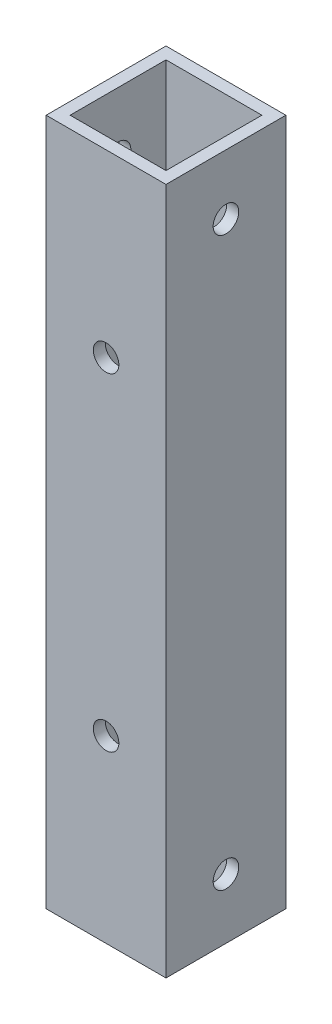
ISO-10303-21;
HEADER;
FILE_DESCRIPTION(('STEP AP214'),'2;1');
FILE_NAME('part.step','',(''),(''),'','','');
FILE_SCHEMA(('AUTOMOTIVE_DESIGN { 1 0 10303 214 1 1 1 1 }'));
ENDSEC;
DATA;
#1=APPLICATION_CONTEXT('core data for automotive mechanical design processes');
#2=APPLICATION_PROTOCOL_DEFINITION('international standard','automotive_design',2000,#1);
#3=PRODUCT_CONTEXT('',#1,'mechanical');
#4=PRODUCT('Part','Part','',(#3));
#5=PRODUCT_RELATED_PRODUCT_CATEGORY('part','',(#4));
#6=PRODUCT_DEFINITION_FORMATION('','',#4);
#7=PRODUCT_DEFINITION_CONTEXT('part definition',#1,'design');
#8=PRODUCT_DEFINITION('design','',#6,#7);
#9=PRODUCT_DEFINITION_SHAPE('','',#8);
#10=(LENGTH_UNIT() NAMED_UNIT(*) SI_UNIT(.MILLI.,.METRE.));
#11=(NAMED_UNIT(*) PLANE_ANGLE_UNIT() SI_UNIT($,.RADIAN.));
#12=(NAMED_UNIT(*) SI_UNIT($,.STERADIAN.) SOLID_ANGLE_UNIT());
#13=UNCERTAINTY_MEASURE_WITH_UNIT(LENGTH_MEASURE(1.E-05),#10,'distance_accuracy_value','');
#14=(GEOMETRIC_REPRESENTATION_CONTEXT(3) GLOBAL_UNCERTAINTY_ASSIGNED_CONTEXT((#13)) GLOBAL_UNIT_ASSIGNED_CONTEXT((#10,
#11,#12)) REPRESENTATION_CONTEXT('',''));
#15=CARTESIAN_POINT('',(0.,0.,0.));
#16=DIRECTION('',(0.,0.,1.));
#17=DIRECTION('',(1.,0.,0.));
#18=AXIS2_PLACEMENT_3D('',#15,#16,#17);
#19=CARTESIAN_POINT('',(0.,86.,0.));
#20=DIRECTION('',(0.,1.,0.));
#21=DIRECTION('',(0.,0.,1.));
#22=AXIS2_PLACEMENT_3D('',#19,#20,#21);
#23=PLANE('',#22);
#24=DIRECTION('',(0.,0.,-1.));
#25=VECTOR('',#24,1.);
#26=CARTESIAN_POINT('',(7.5,86.,-7.5));
#27=LINE('',#26,#25);
#28=CARTESIAN_POINT('',(7.5,86.,7.5));
#29=VERTEX_POINT('',#28);
#30=CARTESIAN_POINT('',(7.5,86.,-7.5));
#31=VERTEX_POINT('',#30);
#32=EDGE_CURVE('E157',#29,#31,#27,.T.);
#33=ORIENTED_EDGE('',*,*,#32,.T.);
#34=DIRECTION('',(-1.,0.,0.));
#35=VECTOR('',#34,1.);
#36=CARTESIAN_POINT('',(-7.5,86.,-7.5));
#37=LINE('',#36,#35);
#38=CARTESIAN_POINT('',(-7.5,86.,-7.5));
#39=VERTEX_POINT('',#38);
#40=EDGE_CURVE('E161',#31,#39,#37,.T.);
#41=ORIENTED_EDGE('',*,*,#40,.T.);
#42=DIRECTION('',(0.,0.,1.));
#43=VECTOR('',#42,1.);
#44=CARTESIAN_POINT('',(-7.5,86.,-7.5));
#45=LINE('',#44,#43);
#46=CARTESIAN_POINT('',(-7.5,86.,7.5));
#47=VERTEX_POINT('',#46);
#48=EDGE_CURVE('E165',#39,#47,#45,.T.);
#49=ORIENTED_EDGE('',*,*,#48,.T.);
#50=DIRECTION('',(1.,0.,0.));
#51=VECTOR('',#50,1.);
#52=CARTESIAN_POINT('',(-7.5,86.,7.5));
#53=LINE('',#52,#51);
#54=EDGE_CURVE('E168',#47,#29,#53,.T.);
#55=ORIENTED_EDGE('',*,*,#54,.T.);
#56=EDGE_LOOP('',(#33,#41,#49,#55));
#57=FACE_BOUND('',#56,.T.);
#58=DIRECTION('',(1.,0.,0.));
#59=VECTOR('',#58,1.);
#60=CARTESIAN_POINT('',(-6.,86.,6.));
#61=LINE('',#60,#59);
#62=CARTESIAN_POINT('',(-6.,86.,6.));
#63=VERTEX_POINT('',#62);
#64=CARTESIAN_POINT('',(6.,86.,6.));
#65=VERTEX_POINT('',#64);
#66=EDGE_CURVE('E116',#63,#65,#61,.T.);
#67=ORIENTED_EDGE('',*,*,#66,.F.);
#68=DIRECTION('',(0.,0.,1.));
#69=VECTOR('',#68,1.);
#70=CARTESIAN_POINT('',(-6.,86.,-6.));
#71=LINE('',#70,#69);
#72=CARTESIAN_POINT('',(-6.,86.,-6.));
#73=VERTEX_POINT('',#72);
#74=EDGE_CURVE('E107',#73,#63,#71,.T.);
#75=ORIENTED_EDGE('',*,*,#74,.F.);
#76=DIRECTION('',(-1.,0.,0.));
#77=VECTOR('',#76,1.);
#78=CARTESIAN_POINT('',(-6.,86.,-6.));
#79=LINE('',#78,#77);
#80=CARTESIAN_POINT('',(6.,86.,-6.));
#81=VERTEX_POINT('',#80);
#82=EDGE_CURVE('E133',#81,#73,#79,.T.);
#83=ORIENTED_EDGE('',*,*,#82,.F.);
#84=DIRECTION('',(0.,0.,-1.));
#85=VECTOR('',#84,1.);
#86=CARTESIAN_POINT('',(6.,86.,-6.));
#87=LINE('',#86,#85);
#88=EDGE_CURVE('E129',#65,#81,#87,.T.);
#89=ORIENTED_EDGE('',*,*,#88,.F.);
#90=EDGE_LOOP('',(#67,#75,#83,#89));
#91=FACE_BOUND('',#90,.T.);
#92=ADVANCED_FACE('F39',(#57,#91),#23,.T.);
#93=CARTESIAN_POINT('',(0.,0.,0.));
#94=DIRECTION('',(0.,1.,0.));
#95=DIRECTION('',(0.,0.,1.));
#96=AXIS2_PLACEMENT_3D('',#93,#94,#95);
#97=PLANE('',#96);
#98=DIRECTION('',(0.,0.,-1.));
#99=VECTOR('',#98,1.);
#100=CARTESIAN_POINT('',(7.5,0.,-7.5));
#101=LINE('',#100,#99);
#102=CARTESIAN_POINT('',(7.5,0.,7.5));
#103=VERTEX_POINT('',#102);
#104=CARTESIAN_POINT('',(7.5,0.,-7.5));
#105=VERTEX_POINT('',#104);
#106=EDGE_CURVE('E125',#103,#105,#101,.T.);
#107=ORIENTED_EDGE('',*,*,#106,.F.);
#108=DIRECTION('',(1.,0.,0.));
#109=VECTOR('',#108,1.);
#110=CARTESIAN_POINT('',(-7.5,0.,7.5));
#111=LINE('',#110,#109);
#112=CARTESIAN_POINT('',(-7.5,0.,7.5));
#113=VERTEX_POINT('',#112);
#114=EDGE_CURVE('E162',#113,#103,#111,.T.);
#115=ORIENTED_EDGE('',*,*,#114,.F.);
#116=DIRECTION('',(0.,0.,1.));
#117=VECTOR('',#116,1.);
#118=CARTESIAN_POINT('',(-7.5,0.,-7.5));
#119=LINE('',#118,#117);
#120=CARTESIAN_POINT('',(-7.5,0.,-7.5));
#121=VERTEX_POINT('',#120);
#122=EDGE_CURVE('E178',#121,#113,#119,.T.);
#123=ORIENTED_EDGE('',*,*,#122,.F.);
#124=DIRECTION('',(-1.,0.,0.));
#125=VECTOR('',#124,1.);
#126=CARTESIAN_POINT('',(-7.5,0.,-7.5));
#127=LINE('',#126,#125);
#128=EDGE_CURVE('E175',#105,#121,#127,.T.);
#129=ORIENTED_EDGE('',*,*,#128,.F.);
#130=EDGE_LOOP('',(#107,#115,#123,#129));
#131=FACE_BOUND('',#130,.T.);
#132=DIRECTION('',(0.,0.,1.));
#133=VECTOR('',#132,1.);
#134=CARTESIAN_POINT('',(-6.,0.,-6.));
#135=LINE('',#134,#133);
#136=CARTESIAN_POINT('',(-6.,0.,-6.));
#137=VERTEX_POINT('',#136);
#138=CARTESIAN_POINT('',(-6.,0.,6.));
#139=VERTEX_POINT('',#138);
#140=EDGE_CURVE('E65',#137,#139,#135,.T.);
#141=ORIENTED_EDGE('',*,*,#140,.T.);
#142=DIRECTION('',(1.,0.,0.));
#143=VECTOR('',#142,1.);
#144=CARTESIAN_POINT('',(-6.,0.,6.));
#145=LINE('',#144,#143);
#146=CARTESIAN_POINT('',(6.,0.,6.));
#147=VERTEX_POINT('',#146);
#148=EDGE_CURVE('E123',#139,#147,#145,.T.);
#149=ORIENTED_EDGE('',*,*,#148,.T.);
#150=DIRECTION('',(0.,0.,-1.));
#151=VECTOR('',#150,1.);
#152=CARTESIAN_POINT('',(6.,0.,-6.));
#153=LINE('',#152,#151);
#154=CARTESIAN_POINT('',(6.,0.,-6.));
#155=VERTEX_POINT('',#154);
#156=EDGE_CURVE('E144',#147,#155,#153,.T.);
#157=ORIENTED_EDGE('',*,*,#156,.T.);
#158=DIRECTION('',(-1.,0.,0.));
#159=VECTOR('',#158,1.);
#160=CARTESIAN_POINT('',(-6.,0.,-6.));
#161=LINE('',#160,#159);
#162=EDGE_CURVE('E117',#155,#137,#161,.T.);
#163=ORIENTED_EDGE('',*,*,#162,.T.);
#164=EDGE_LOOP('',(#141,#149,#157,#163));
#165=FACE_BOUND('',#164,.T.);
#166=ADVANCED_FACE('F288',(#131,#165),#97,.F.);
#167=CARTESIAN_POINT('',(7.5,86.,-7.5));
#168=DIRECTION('',(-1.,0.,0.));
#169=DIRECTION('',(0.,0.,1.));
#170=AXIS2_PLACEMENT_3D('',#167,#168,#169);
#171=PLANE('',#170);
#172=CARTESIAN_POINT('',(7.5,78.5,0.));
#173=DIRECTION('',(1.,0.,0.));
#174=DIRECTION('',(0.,0.,-1.));
#175=AXIS2_PLACEMENT_3D('',#172,#173,#174);
#176=CIRCLE('',#175,1.6);
#177=CARTESIAN_POINT('',(7.5,78.5,-1.6));
#178=VERTEX_POINT('',#177);
#179=EDGE_CURVE('E214',#178,#178,#176,.T.);
#180=ORIENTED_EDGE('',*,*,#179,.F.);
#181=EDGE_LOOP('',(#180));
#182=FACE_BOUND('',#181,.T.);
#183=CARTESIAN_POINT('',(7.5,7.5,0.));
#184=DIRECTION('',(1.,0.,0.));
#185=DIRECTION('',(0.,0.,-1.));
#186=AXIS2_PLACEMENT_3D('',#183,#184,#185);
#187=CIRCLE('',#186,1.6);
#188=CARTESIAN_POINT('',(7.5,7.5,-1.6));
#189=VERTEX_POINT('',#188);
#190=EDGE_CURVE('E226',#189,#189,#187,.T.);
#191=ORIENTED_EDGE('',*,*,#190,.F.);
#192=EDGE_LOOP('',(#191));
#193=FACE_BOUND('',#192,.T.);
#194=ORIENTED_EDGE('',*,*,#106,.T.);
#195=DIRECTION('',(0.,-1.,0.));
#196=VECTOR('',#195,1.);
#197=CARTESIAN_POINT('',(7.5,86.,-7.5));
#198=LINE('',#197,#196);
#199=EDGE_CURVE('E11',#31,#105,#198,.T.);
#200=ORIENTED_EDGE('',*,*,#199,.F.);
#201=ORIENTED_EDGE('',*,*,#32,.F.);
#202=DIRECTION('',(0.,-1.,0.));
#203=VECTOR('',#202,1.);
#204=CARTESIAN_POINT('',(7.5,86.,7.5));
#205=LINE('',#204,#203);
#206=EDGE_CURVE('E171',#29,#103,#205,.T.);
#207=ORIENTED_EDGE('',*,*,#206,.T.);
#208=EDGE_LOOP('',(#194,#200,#201,#207));
#209=FACE_BOUND('',#208,.T.);
#210=ADVANCED_FACE('F41',(#182,#193,#209),#171,.F.);
#211=CARTESIAN_POINT('',(-7.5,86.,-7.5));
#212=DIRECTION('',(0.,0.,1.));
#213=DIRECTION('',(1.,0.,0.));
#214=AXIS2_PLACEMENT_3D('',#211,#212,#213);
#215=PLANE('',#214);
#216=CARTESIAN_POINT('',(0.,63.5,-7.5));
#217=DIRECTION('',(0.,0.,1.));
#218=DIRECTION('',(1.,0.,0.));
#219=AXIS2_PLACEMENT_3D('',#216,#217,#218);
#220=CIRCLE('',#219,1.6);
#221=CARTESIAN_POINT('',(1.6,63.5,-7.5));
#222=VERTEX_POINT('',#221);
#223=EDGE_CURVE('E198',#222,#222,#220,.T.);
#224=ORIENTED_EDGE('',*,*,#223,.T.);
#225=EDGE_LOOP('',(#224));
#226=FACE_BOUND('',#225,.T.);
#227=CARTESIAN_POINT('',(0.,22.5,-7.5));
#228=DIRECTION('',(0.,0.,1.));
#229=DIRECTION('',(1.,0.,0.));
#230=AXIS2_PLACEMENT_3D('',#227,#228,#229);
#231=CIRCLE('',#230,1.6);
#232=CARTESIAN_POINT('',(1.6,22.5,-7.5));
#233=VERTEX_POINT('',#232);
#234=EDGE_CURVE('E242',#233,#233,#231,.T.);
#235=ORIENTED_EDGE('',*,*,#234,.T.);
#236=EDGE_LOOP('',(#235));
#237=FACE_BOUND('',#236,.T.);
#238=ORIENTED_EDGE('',*,*,#128,.T.);
#239=DIRECTION('',(0.,-1.,0.));
#240=VECTOR('',#239,1.);
#241=CARTESIAN_POINT('',(-7.5,86.,-7.5));
#242=LINE('',#241,#240);
#243=EDGE_CURVE('E49',#39,#121,#242,.T.);
#244=ORIENTED_EDGE('',*,*,#243,.F.);
#245=ORIENTED_EDGE('',*,*,#40,.F.);
#246=ORIENTED_EDGE('',*,*,#199,.T.);
#247=EDGE_LOOP('',(#238,#244,#245,#246));
#248=FACE_BOUND('',#247,.T.);
#249=ADVANCED_FACE('F292',(#226,#237,#248),#215,.F.);
#250=CARTESIAN_POINT('',(-7.5,86.,-7.5));
#251=DIRECTION('',(1.,0.,0.));
#252=DIRECTION('',(0.,0.,-1.));
#253=AXIS2_PLACEMENT_3D('',#250,#251,#252);
#254=PLANE('',#253);
#255=CARTESIAN_POINT('',(-7.5,78.5,0.));
#256=DIRECTION('',(1.,0.,0.));
#257=DIRECTION('',(0.,0.,-1.));
#258=AXIS2_PLACEMENT_3D('',#255,#256,#257);
#259=CIRCLE('',#258,1.6);
#260=CARTESIAN_POINT('',(-7.5,78.5,-1.6));
#261=VERTEX_POINT('',#260);
#262=EDGE_CURVE('E206',#261,#261,#259,.T.);
#263=ORIENTED_EDGE('',*,*,#262,.T.);
#264=EDGE_LOOP('',(#263));
#265=FACE_BOUND('',#264,.T.);
#266=CARTESIAN_POINT('',(-7.5,7.5,0.));
#267=DIRECTION('',(1.,0.,0.));
#268=DIRECTION('',(0.,0.,-1.));
#269=AXIS2_PLACEMENT_3D('',#266,#267,#268);
#270=CIRCLE('',#269,1.6);
#271=CARTESIAN_POINT('',(-7.5,7.5,-1.6));
#272=VERTEX_POINT('',#271);
#273=EDGE_CURVE('E220',#272,#272,#270,.T.);
#274=ORIENTED_EDGE('',*,*,#273,.T.);
#275=EDGE_LOOP('',(#274));
#276=FACE_BOUND('',#275,.T.);
#277=ORIENTED_EDGE('',*,*,#122,.T.);
#278=DIRECTION('',(0.,-1.,0.));
#279=VECTOR('',#278,1.);
#280=CARTESIAN_POINT('',(-7.5,86.,7.5));
#281=LINE('',#280,#279);
#282=EDGE_CURVE('E186',#47,#113,#281,.T.);
#283=ORIENTED_EDGE('',*,*,#282,.F.);
#284=ORIENTED_EDGE('',*,*,#48,.F.);
#285=ORIENTED_EDGE('',*,*,#243,.T.);
#286=EDGE_LOOP('',(#277,#283,#284,#285));
#287=FACE_BOUND('',#286,.T.);
#288=ADVANCED_FACE('F275',(#265,#276,#287),#254,.F.);
#289=CARTESIAN_POINT('',(-7.5,86.,7.5));
#290=DIRECTION('',(0.,0.,-1.));
#291=DIRECTION('',(-1.,0.,0.));
#292=AXIS2_PLACEMENT_3D('',#289,#290,#291);
#293=PLANE('',#292);
#294=CARTESIAN_POINT('',(0.,63.5,7.5));
#295=DIRECTION('',(0.,0.,1.));
#296=DIRECTION('',(1.,0.,0.));
#297=AXIS2_PLACEMENT_3D('',#294,#295,#296);
#298=CIRCLE('',#297,1.6);
#299=CARTESIAN_POINT('',(1.6,63.5,7.5));
#300=VERTEX_POINT('',#299);
#301=EDGE_CURVE('E238',#300,#300,#298,.T.);
#302=ORIENTED_EDGE('',*,*,#301,.F.);
#303=EDGE_LOOP('',(#302));
#304=FACE_BOUND('',#303,.T.);
#305=CARTESIAN_POINT('',(0.,22.5,7.5));
#306=DIRECTION('',(0.,0.,1.));
#307=DIRECTION('',(1.,0.,0.));
#308=AXIS2_PLACEMENT_3D('',#305,#306,#307);
#309=CIRCLE('',#308,1.6);
#310=CARTESIAN_POINT('',(1.6,22.5,7.5));
#311=VERTEX_POINT('',#310);
#312=EDGE_CURVE('E234',#311,#311,#309,.T.);
#313=ORIENTED_EDGE('',*,*,#312,.F.);
#314=EDGE_LOOP('',(#313));
#315=FACE_BOUND('',#314,.T.);
#316=ORIENTED_EDGE('',*,*,#114,.T.);
#317=ORIENTED_EDGE('',*,*,#206,.F.);
#318=ORIENTED_EDGE('',*,*,#54,.F.);
#319=ORIENTED_EDGE('',*,*,#282,.T.);
#320=EDGE_LOOP('',(#316,#317,#318,#319));
#321=FACE_BOUND('',#320,.T.);
#322=ADVANCED_FACE('F272',(#304,#315,#321),#293,.F.);
#323=CARTESIAN_POINT('',(-6.,86.,-6.));
#324=DIRECTION('',(1.,0.,0.));
#325=DIRECTION('',(0.,0.,-1.));
#326=AXIS2_PLACEMENT_3D('',#323,#324,#325);
#327=PLANE('',#326);
#328=CARTESIAN_POINT('',(-6.,78.5,0.));
#329=DIRECTION('',(1.,0.,0.));
#330=DIRECTION('',(0.,0.,-1.));
#331=AXIS2_PLACEMENT_3D('',#328,#329,#330);
#332=CIRCLE('',#331,1.6);
#333=CARTESIAN_POINT('',(-6.,78.5,-1.6));
#334=VERTEX_POINT('',#333);
#335=EDGE_CURVE('E230',#334,#334,#332,.T.);
#336=ORIENTED_EDGE('',*,*,#335,.F.);
#337=EDGE_LOOP('',(#336));
#338=FACE_BOUND('',#337,.T.);
#339=CARTESIAN_POINT('',(-6.,7.5,0.));
#340=DIRECTION('',(1.,0.,0.));
#341=DIRECTION('',(0.,0.,-1.));
#342=AXIS2_PLACEMENT_3D('',#339,#340,#341);
#343=CIRCLE('',#342,1.6);
#344=CARTESIAN_POINT('',(-6.,7.5,-1.6));
#345=VERTEX_POINT('',#344);
#346=EDGE_CURVE('E205',#345,#345,#343,.T.);
#347=ORIENTED_EDGE('',*,*,#346,.F.);
#348=EDGE_LOOP('',(#347));
#349=FACE_BOUND('',#348,.T.);
#350=ORIENTED_EDGE('',*,*,#140,.F.);
#351=DIRECTION('',(0.,-1.,0.));
#352=VECTOR('',#351,1.);
#353=CARTESIAN_POINT('',(-6.,86.,-6.));
#354=LINE('',#353,#352);
#355=EDGE_CURVE('E111',#73,#137,#354,.T.);
#356=ORIENTED_EDGE('',*,*,#355,.F.);
#357=ORIENTED_EDGE('',*,*,#74,.T.);
#358=DIRECTION('',(0.,-1.,0.));
#359=VECTOR('',#358,1.);
#360=CARTESIAN_POINT('',(-6.,86.,6.));
#361=LINE('',#360,#359);
#362=EDGE_CURVE('E110',#63,#139,#361,.T.);
#363=ORIENTED_EDGE('',*,*,#362,.T.);
#364=EDGE_LOOP('',(#350,#356,#357,#363));
#365=FACE_BOUND('',#364,.T.);
#366=ADVANCED_FACE('F109',(#338,#349,#365),#327,.T.);
#367=CARTESIAN_POINT('',(-6.,86.,6.));
#368=DIRECTION('',(0.,0.,-1.));
#369=DIRECTION('',(-1.,0.,0.));
#370=AXIS2_PLACEMENT_3D('',#367,#368,#369);
#371=PLANE('',#370);
#372=CARTESIAN_POINT('',(0.,63.5,6.));
#373=DIRECTION('',(0.,0.,-1.));
#374=DIRECTION('',(-1.,0.,0.));
#375=AXIS2_PLACEMENT_3D('',#372,#373,#374);
#376=CIRCLE('',#375,1.6);
#377=CARTESIAN_POINT('',(-1.60000000000001,63.5,6.));
#378=VERTEX_POINT('',#377);
#379=EDGE_CURVE('E141',#378,#378,#376,.T.);
#380=ORIENTED_EDGE('',*,*,#379,.F.);
#381=EDGE_LOOP('',(#380));
#382=FACE_BOUND('',#381,.T.);
#383=CARTESIAN_POINT('',(0.,22.5,6.));
#384=DIRECTION('',(0.,0.,-1.));
#385=DIRECTION('',(-1.,0.,0.));
#386=AXIS2_PLACEMENT_3D('',#383,#384,#385);
#387=CIRCLE('',#386,1.6);
#388=CARTESIAN_POINT('',(-1.6,22.5,6.));
#389=VERTEX_POINT('',#388);
#390=EDGE_CURVE('E197',#389,#389,#387,.T.);
#391=ORIENTED_EDGE('',*,*,#390,.F.);
#392=EDGE_LOOP('',(#391));
#393=FACE_BOUND('',#392,.T.);
#394=ORIENTED_EDGE('',*,*,#148,.F.);
#395=ORIENTED_EDGE('',*,*,#362,.F.);
#396=ORIENTED_EDGE('',*,*,#66,.T.);
#397=DIRECTION('',(0.,-1.,0.));
#398=VECTOR('',#397,1.);
#399=CARTESIAN_POINT('',(6.,86.,6.));
#400=LINE('',#399,#398);
#401=EDGE_CURVE('E126',#65,#147,#400,.T.);
#402=ORIENTED_EDGE('',*,*,#401,.T.);
#403=EDGE_LOOP('',(#394,#395,#396,#402));
#404=FACE_BOUND('',#403,.T.);
#405=ADVANCED_FACE('F120',(#382,#393,#404),#371,.T.);
#406=CARTESIAN_POINT('',(6.,86.,-6.));
#407=DIRECTION('',(-1.,0.,0.));
#408=DIRECTION('',(0.,0.,1.));
#409=AXIS2_PLACEMENT_3D('',#406,#407,#408);
#410=PLANE('',#409);
#411=CARTESIAN_POINT('',(6.,78.5,0.));
#412=DIRECTION('',(-1.,0.,0.));
#413=DIRECTION('',(0.,0.,1.));
#414=AXIS2_PLACEMENT_3D('',#411,#412,#413);
#415=CIRCLE('',#414,1.6);
#416=CARTESIAN_POINT('',(6.,78.5,1.6));
#417=VERTEX_POINT('',#416);
#418=EDGE_CURVE('E43',#417,#417,#415,.T.);
#419=ORIENTED_EDGE('',*,*,#418,.F.);
#420=EDGE_LOOP('',(#419));
#421=FACE_BOUND('',#420,.T.);
#422=CARTESIAN_POINT('',(6.,7.5,0.));
#423=DIRECTION('',(-1.,0.,0.));
#424=DIRECTION('',(0.,0.,1.));
#425=AXIS2_PLACEMENT_3D('',#422,#423,#424);
#426=CIRCLE('',#425,1.6);
#427=CARTESIAN_POINT('',(6.,7.5,1.6));
#428=VERTEX_POINT('',#427);
#429=EDGE_CURVE('E202',#428,#428,#426,.T.);
#430=ORIENTED_EDGE('',*,*,#429,.F.);
#431=EDGE_LOOP('',(#430));
#432=FACE_BOUND('',#431,.T.);
#433=ORIENTED_EDGE('',*,*,#156,.F.);
#434=ORIENTED_EDGE('',*,*,#401,.F.);
#435=ORIENTED_EDGE('',*,*,#88,.T.);
#436=DIRECTION('',(0.,-1.,0.));
#437=VECTOR('',#436,1.);
#438=CARTESIAN_POINT('',(6.,86.,-6.));
#439=LINE('',#438,#437);
#440=EDGE_CURVE('E57',#81,#155,#439,.T.);
#441=ORIENTED_EDGE('',*,*,#440,.T.);
#442=EDGE_LOOP('',(#433,#434,#435,#441));
#443=FACE_BOUND('',#442,.T.);
#444=ADVANCED_FACE('F260',(#421,#432,#443),#410,.T.);
#445=CARTESIAN_POINT('',(-6.,86.,-6.));
#446=DIRECTION('',(0.,0.,1.));
#447=DIRECTION('',(1.,0.,0.));
#448=AXIS2_PLACEMENT_3D('',#445,#446,#447);
#449=PLANE('',#448);
#450=CARTESIAN_POINT('',(0.,63.5,-6.));
#451=DIRECTION('',(0.,0.,1.));
#452=DIRECTION('',(1.,0.,0.));
#453=AXIS2_PLACEMENT_3D('',#450,#451,#452);
#454=CIRCLE('',#453,1.6);
#455=CARTESIAN_POINT('',(1.6,63.5,-6.));
#456=VERTEX_POINT('',#455);
#457=EDGE_CURVE('E199',#456,#456,#454,.T.);
#458=ORIENTED_EDGE('',*,*,#457,.F.);
#459=EDGE_LOOP('',(#458));
#460=FACE_BOUND('',#459,.T.);
#461=CARTESIAN_POINT('',(0.,22.5,-6.));
#462=DIRECTION('',(0.,0.,1.));
#463=DIRECTION('',(1.,0.,0.));
#464=AXIS2_PLACEMENT_3D('',#461,#462,#463);
#465=CIRCLE('',#464,1.6);
#466=CARTESIAN_POINT('',(1.6,22.5,-6.));
#467=VERTEX_POINT('',#466);
#468=EDGE_CURVE('E193',#467,#467,#465,.T.);
#469=ORIENTED_EDGE('',*,*,#468,.F.);
#470=EDGE_LOOP('',(#469));
#471=FACE_BOUND('',#470,.T.);
#472=ORIENTED_EDGE('',*,*,#162,.F.);
#473=ORIENTED_EDGE('',*,*,#440,.F.);
#474=ORIENTED_EDGE('',*,*,#82,.T.);
#475=ORIENTED_EDGE('',*,*,#355,.T.);
#476=EDGE_LOOP('',(#472,#473,#474,#475));
#477=FACE_BOUND('',#476,.T.);
#478=ADVANCED_FACE('F315',(#460,#471,#477),#449,.T.);
#479=CARTESIAN_POINT('',(0.,22.5,-7.5));
#480=DIRECTION('',(0.,0.,1.));
#481=DIRECTION('',(1.,0.,0.));
#482=AXIS2_PLACEMENT_3D('',#479,#480,#481);
#483=CYLINDRICAL_SURFACE('',#482,1.6);
#484=ORIENTED_EDGE('',*,*,#468,.T.);
#485=EDGE_LOOP('',(#484));
#486=FACE_BOUND('',#485,.T.);
#487=ORIENTED_EDGE('',*,*,#234,.F.);
#488=EDGE_LOOP('',(#487));
#489=FACE_BOUND('',#488,.T.);
#490=ADVANCED_FACE('F269',(#486,#489),#483,.F.);
#491=CARTESIAN_POINT('',(0.,63.5,-7.5));
#492=DIRECTION('',(0.,0.,1.));
#493=DIRECTION('',(1.,0.,0.));
#494=AXIS2_PLACEMENT_3D('',#491,#492,#493);
#495=CYLINDRICAL_SURFACE('',#494,1.6);
#496=ORIENTED_EDGE('',*,*,#457,.T.);
#497=EDGE_LOOP('',(#496));
#498=FACE_BOUND('',#497,.T.);
#499=ORIENTED_EDGE('',*,*,#223,.F.);
#500=EDGE_LOOP('',(#499));
#501=FACE_BOUND('',#500,.T.);
#502=ADVANCED_FACE('F267',(#498,#501),#495,.F.);
#503=ORIENTED_EDGE('',*,*,#390,.T.);
#504=EDGE_LOOP('',(#503));
#505=FACE_BOUND('',#504,.T.);
#506=ORIENTED_EDGE('',*,*,#312,.T.);
#507=EDGE_LOOP('',(#506));
#508=FACE_BOUND('',#507,.T.);
#509=ADVANCED_FACE('F264',(#505,#508),#483,.F.);
#510=ORIENTED_EDGE('',*,*,#379,.T.);
#511=EDGE_LOOP('',(#510));
#512=FACE_BOUND('',#511,.T.);
#513=ORIENTED_EDGE('',*,*,#301,.T.);
#514=EDGE_LOOP('',(#513));
#515=FACE_BOUND('',#514,.T.);
#516=ADVANCED_FACE('F255',(#512,#515),#495,.F.);
#517=CARTESIAN_POINT('',(-7.5,7.5,0.));
#518=DIRECTION('',(1.,0.,0.));
#519=DIRECTION('',(0.,0.,-1.));
#520=AXIS2_PLACEMENT_3D('',#517,#518,#519);
#521=CYLINDRICAL_SURFACE('',#520,1.6);
#522=ORIENTED_EDGE('',*,*,#429,.T.);
#523=EDGE_LOOP('',(#522));
#524=FACE_BOUND('',#523,.T.);
#525=ORIENTED_EDGE('',*,*,#190,.T.);
#526=EDGE_LOOP('',(#525));
#527=FACE_BOUND('',#526,.T.);
#528=ADVANCED_FACE('F325',(#524,#527),#521,.F.);
#529=CARTESIAN_POINT('',(-7.5,78.5,0.));
#530=DIRECTION('',(1.,0.,0.));
#531=DIRECTION('',(0.,0.,-1.));
#532=AXIS2_PLACEMENT_3D('',#529,#530,#531);
#533=CYLINDRICAL_SURFACE('',#532,1.6);
#534=ORIENTED_EDGE('',*,*,#418,.T.);
#535=EDGE_LOOP('',(#534));
#536=FACE_BOUND('',#535,.T.);
#537=ORIENTED_EDGE('',*,*,#179,.T.);
#538=EDGE_LOOP('',(#537));
#539=FACE_BOUND('',#538,.T.);
#540=ADVANCED_FACE('F328',(#536,#539),#533,.F.);
#541=ORIENTED_EDGE('',*,*,#346,.T.);
#542=EDGE_LOOP('',(#541));
#543=FACE_BOUND('',#542,.T.);
#544=ORIENTED_EDGE('',*,*,#273,.F.);
#545=EDGE_LOOP('',(#544));
#546=FACE_BOUND('',#545,.T.);
#547=ADVANCED_FACE('F329',(#543,#546),#521,.F.);
#548=ORIENTED_EDGE('',*,*,#335,.T.);
#549=EDGE_LOOP('',(#548));
#550=FACE_BOUND('',#549,.T.);
#551=ORIENTED_EDGE('',*,*,#262,.F.);
#552=EDGE_LOOP('',(#551));
#553=FACE_BOUND('',#552,.T.);
#554=ADVANCED_FACE('F332',(#550,#553),#533,.F.);
#555=CLOSED_SHELL('',(#92,#166,#210,#249,#288,#322,#366,#405,#444,#478,#490,#502,#509,#516,#528,
#540,#547,#554));
#556=MANIFOLD_SOLID_BREP('B2',#555);
#557=ADVANCED_BREP_SHAPE_REPRESENTATION('',(#18,#556),#14);
#558=SHAPE_DEFINITION_REPRESENTATION(#9,#557);
ENDSEC;
END-ISO-10303-21;
